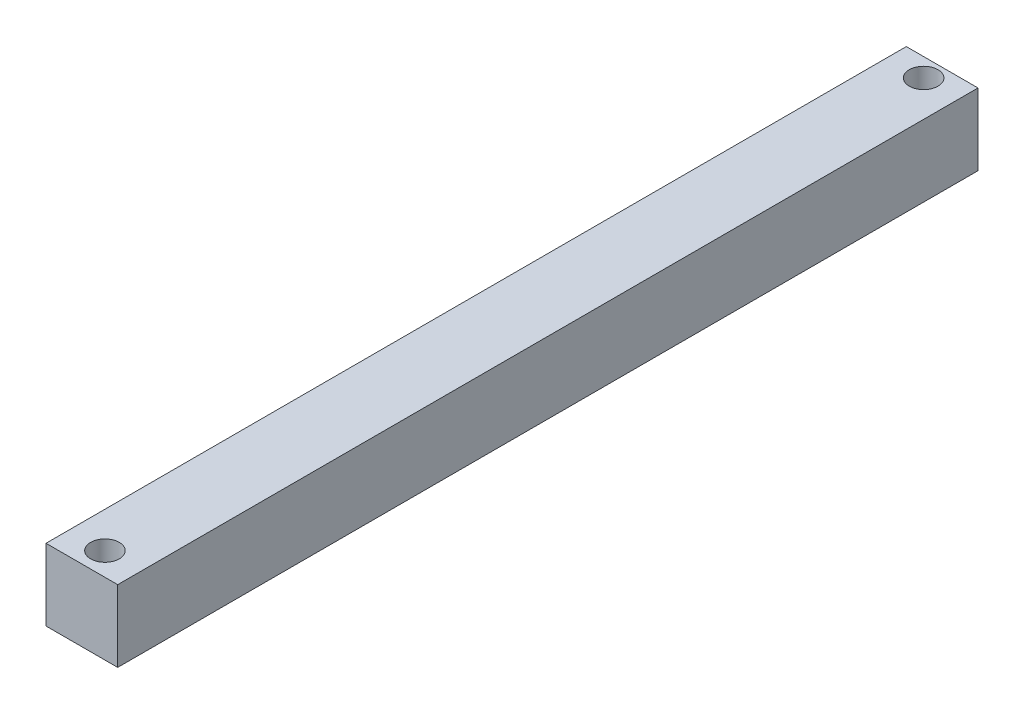
ISO-10303-21;
HEADER;
FILE_DESCRIPTION(('STEP AP214'),'2;1');
FILE_NAME('part.step','',(''),(''),'','','');
FILE_SCHEMA(('AUTOMOTIVE_DESIGN { 1 0 10303 214 1 1 1 1 }'));
ENDSEC;
DATA;
#1=APPLICATION_CONTEXT('core data for automotive mechanical design processes');
#2=APPLICATION_PROTOCOL_DEFINITION('international standard','automotive_design',2000,#1);
#3=PRODUCT_CONTEXT('',#1,'mechanical');
#4=PRODUCT('Part','Part','',(#3));
#5=PRODUCT_RELATED_PRODUCT_CATEGORY('part','',(#4));
#6=PRODUCT_DEFINITION_FORMATION('','',#4);
#7=PRODUCT_DEFINITION_CONTEXT('part definition',#1,'design');
#8=PRODUCT_DEFINITION('design','',#6,#7);
#9=PRODUCT_DEFINITION_SHAPE('','',#8);
#10=(LENGTH_UNIT() NAMED_UNIT(*) SI_UNIT(.MILLI.,.METRE.));
#11=(NAMED_UNIT(*) PLANE_ANGLE_UNIT() SI_UNIT($,.RADIAN.));
#12=(NAMED_UNIT(*) SI_UNIT($,.STERADIAN.) SOLID_ANGLE_UNIT());
#13=UNCERTAINTY_MEASURE_WITH_UNIT(LENGTH_MEASURE(1.E-05),#10,'distance_accuracy_value','');
#14=(GEOMETRIC_REPRESENTATION_CONTEXT(3) GLOBAL_UNCERTAINTY_ASSIGNED_CONTEXT((#13)) GLOBAL_UNIT_ASSIGNED_CONTEXT((#10,
#11,#12)) REPRESENTATION_CONTEXT('',''));
#15=CARTESIAN_POINT('',(0.,0.,0.));
#16=DIRECTION('',(0.,0.,1.));
#17=DIRECTION('',(1.,0.,0.));
#18=AXIS2_PLACEMENT_3D('',#15,#16,#17);
#19=CARTESIAN_POINT('',(-14.1298875809077,10.6681034482759,360.));
#20=DIRECTION('',(1.,0.,0.));
#21=DIRECTION('',(0.,1.,0.));
#22=AXIS2_PLACEMENT_3D('',#19,#20,#21);
#23=PLANE('',#22);
#24=DIRECTION('',(0.,-1.,0.));
#25=VECTOR('',#24,1.);
#26=CARTESIAN_POINT('',(-14.1298875809077,10.6681034482759,0.));
#27=LINE('',#26,#25);
#28=CARTESIAN_POINT('',(-14.1298875809077,10.6681034482759,0.));
#29=VERTEX_POINT('',#28);
#30=CARTESIAN_POINT('',(-14.1298875809077,-19.3318965517241,0.));
#31=VERTEX_POINT('',#30);
#32=EDGE_CURVE('E96',#29,#31,#27,.T.);
#33=ORIENTED_EDGE('',*,*,#32,.T.);
#34=DIRECTION('',(0.,0.,-1.));
#35=VECTOR('',#34,1.);
#36=CARTESIAN_POINT('',(-14.1298875809077,-19.3318965517241,360.));
#37=LINE('',#36,#35);
#38=CARTESIAN_POINT('',(-14.1298875809077,-19.3318965517241,360.));
#39=VERTEX_POINT('',#38);
#40=EDGE_CURVE('E11',#39,#31,#37,.T.);
#41=ORIENTED_EDGE('',*,*,#40,.F.);
#42=DIRECTION('',(0.,-1.,0.));
#43=VECTOR('',#42,1.);
#44=CARTESIAN_POINT('',(-14.1298875809077,10.6681034482759,360.));
#45=LINE('',#44,#43);
#46=CARTESIAN_POINT('',(-14.1298875809077,10.6681034482759,360.));
#47=VERTEX_POINT('',#46);
#48=EDGE_CURVE('E84',#47,#39,#45,.T.);
#49=ORIENTED_EDGE('',*,*,#48,.F.);
#50=DIRECTION('',(0.,0.,-1.));
#51=VECTOR('',#50,1.);
#52=CARTESIAN_POINT('',(-14.1298875809077,10.6681034482759,360.));
#53=LINE('',#52,#51);
#54=EDGE_CURVE('E92',#47,#29,#53,.T.);
#55=ORIENTED_EDGE('',*,*,#54,.T.);
#56=EDGE_LOOP('',(#33,#41,#49,#55));
#57=FACE_BOUND('',#56,.T.);
#58=ADVANCED_FACE('F33',(#57),#23,.F.);
#59=CARTESIAN_POINT('',(-14.1298875809077,-19.3318965517241,360.));
#60=DIRECTION('',(0.,1.,0.));
#61=DIRECTION('',(0.,0.,1.));
#62=AXIS2_PLACEMENT_3D('',#59,#60,#61);
#63=PLANE('',#62);
#64=CARTESIAN_POINT('',(0.870112419092328,-19.3318965517242,7.74865288261584));
#65=DIRECTION('',(0.,1.,0.));
#66=DIRECTION('',(0.,0.,1.));
#67=AXIS2_PLACEMENT_3D('',#64,#65,#66);
#68=CIRCLE('',#67,6.);
#69=CARTESIAN_POINT('',(0.870112419092328,-19.3318965517242,13.7486528826158));
#70=VERTEX_POINT('',#69);
#71=EDGE_CURVE('E99',#70,#70,#68,.T.);
#72=ORIENTED_EDGE('',*,*,#71,.T.);
#73=EDGE_LOOP('',(#72));
#74=FACE_BOUND('',#73,.T.);
#75=CARTESIAN_POINT('',(0.870112419092328,-19.3318965517242,350.334781363644));
#76=DIRECTION('',(0.,1.,0.));
#77=DIRECTION('',(0.,0.,1.));
#78=AXIS2_PLACEMENT_3D('',#75,#76,#77);
#79=CIRCLE('',#78,6.);
#80=CARTESIAN_POINT('',(0.870112419092328,-19.3318965517242,356.334781363644));
#81=VERTEX_POINT('',#80);
#82=EDGE_CURVE('E112',#81,#81,#79,.T.);
#83=ORIENTED_EDGE('',*,*,#82,.T.);
#84=EDGE_LOOP('',(#83));
#85=FACE_BOUND('',#84,.T.);
#86=DIRECTION('',(1.,0.,0.));
#87=VECTOR('',#86,1.);
#88=CARTESIAN_POINT('',(-14.1298875809077,-19.3318965517241,0.));
#89=LINE('',#88,#87);
#90=CARTESIAN_POINT('',(15.8701124190923,-19.3318965517241,0.));
#91=VERTEX_POINT('',#90);
#92=EDGE_CURVE('E88',#31,#91,#89,.T.);
#93=ORIENTED_EDGE('',*,*,#92,.T.);
#94=DIRECTION('',(0.,0.,-1.));
#95=VECTOR('',#94,1.);
#96=CARTESIAN_POINT('',(15.8701124190923,-19.3318965517241,360.));
#97=LINE('',#96,#95);
#98=CARTESIAN_POINT('',(15.8701124190923,-19.3318965517241,360.));
#99=VERTEX_POINT('',#98);
#100=EDGE_CURVE('E41',#99,#91,#97,.T.);
#101=ORIENTED_EDGE('',*,*,#100,.F.);
#102=DIRECTION('',(1.,0.,0.));
#103=VECTOR('',#102,1.);
#104=CARTESIAN_POINT('',(-14.1298875809077,-19.3318965517241,360.));
#105=LINE('',#104,#103);
#106=EDGE_CURVE('E79',#39,#99,#105,.T.);
#107=ORIENTED_EDGE('',*,*,#106,.F.);
#108=ORIENTED_EDGE('',*,*,#40,.T.);
#109=EDGE_LOOP('',(#93,#101,#107,#108));
#110=FACE_BOUND('',#109,.T.);
#111=ADVANCED_FACE('F87',(#74,#85,#110),#63,.F.);
#112=CARTESIAN_POINT('',(15.8701124190923,10.6681034482759,360.));
#113=DIRECTION('',(-1.,0.,0.));
#114=DIRECTION('',(0.,-1.,0.));
#115=AXIS2_PLACEMENT_3D('',#112,#113,#114);
#116=PLANE('',#115);
#117=DIRECTION('',(0.,1.,0.));
#118=VECTOR('',#117,1.);
#119=CARTESIAN_POINT('',(15.8701124190923,10.6681034482759,0.));
#120=LINE('',#119,#118);
#121=CARTESIAN_POINT('',(15.8701124190923,10.6681034482759,0.));
#122=VERTEX_POINT('',#121);
#123=EDGE_CURVE('E66',#91,#122,#120,.T.);
#124=ORIENTED_EDGE('',*,*,#123,.T.);
#125=DIRECTION('',(0.,0.,-1.));
#126=VECTOR('',#125,1.);
#127=CARTESIAN_POINT('',(15.8701124190923,10.6681034482759,360.));
#128=LINE('',#127,#126);
#129=CARTESIAN_POINT('',(15.8701124190923,10.6681034482759,360.));
#130=VERTEX_POINT('',#129);
#131=EDGE_CURVE('E89',#130,#122,#128,.T.);
#132=ORIENTED_EDGE('',*,*,#131,.F.);
#133=DIRECTION('',(0.,1.,0.));
#134=VECTOR('',#133,1.);
#135=CARTESIAN_POINT('',(15.8701124190923,10.6681034482759,360.));
#136=LINE('',#135,#134);
#137=EDGE_CURVE('E82',#99,#130,#136,.T.);
#138=ORIENTED_EDGE('',*,*,#137,.F.);
#139=ORIENTED_EDGE('',*,*,#100,.T.);
#140=EDGE_LOOP('',(#124,#132,#138,#139));
#141=FACE_BOUND('',#140,.T.);
#142=ADVANCED_FACE('F90',(#141),#116,.F.);
#143=CARTESIAN_POINT('',(-14.1298875809077,10.6681034482759,360.));
#144=DIRECTION('',(0.,-1.,0.));
#145=DIRECTION('',(0.,0.,-1.));
#146=AXIS2_PLACEMENT_3D('',#143,#144,#145);
#147=PLANE('',#146);
#148=CARTESIAN_POINT('',(0.870112419092328,10.6681034482759,7.74865288261584));
#149=DIRECTION('',(0.,1.,0.));
#150=DIRECTION('',(0.,0.,1.));
#151=AXIS2_PLACEMENT_3D('',#148,#149,#150);
#152=CIRCLE('',#151,6.);
#153=CARTESIAN_POINT('',(0.870112419092328,10.6681034482759,13.7486528826158));
#154=VERTEX_POINT('',#153);
#155=EDGE_CURVE('E115',#154,#154,#152,.T.);
#156=ORIENTED_EDGE('',*,*,#155,.F.);
#157=EDGE_LOOP('',(#156));
#158=FACE_BOUND('',#157,.T.);
#159=CARTESIAN_POINT('',(0.870112419092328,10.6681034482759,350.334781363644));
#160=DIRECTION('',(0.,1.,0.));
#161=DIRECTION('',(0.,0.,1.));
#162=AXIS2_PLACEMENT_3D('',#159,#160,#161);
#163=CIRCLE('',#162,6.);
#164=CARTESIAN_POINT('',(0.870112419092328,10.6681034482759,356.334781363644));
#165=VERTEX_POINT('',#164);
#166=EDGE_CURVE('E116',#165,#165,#163,.T.);
#167=ORIENTED_EDGE('',*,*,#166,.F.);
#168=EDGE_LOOP('',(#167));
#169=FACE_BOUND('',#168,.T.);
#170=DIRECTION('',(-1.,0.,0.));
#171=VECTOR('',#170,1.);
#172=CARTESIAN_POINT('',(-14.1298875809077,10.6681034482759,0.));
#173=LINE('',#172,#171);
#174=EDGE_CURVE('E72',#122,#29,#173,.T.);
#175=ORIENTED_EDGE('',*,*,#174,.T.);
#176=ORIENTED_EDGE('',*,*,#54,.F.);
#177=DIRECTION('',(-1.,0.,0.));
#178=VECTOR('',#177,1.);
#179=CARTESIAN_POINT('',(-14.1298875809077,10.6681034482759,360.));
#180=LINE('',#179,#178);
#181=EDGE_CURVE('E49',#130,#47,#180,.T.);
#182=ORIENTED_EDGE('',*,*,#181,.F.);
#183=ORIENTED_EDGE('',*,*,#131,.T.);
#184=EDGE_LOOP('',(#175,#176,#182,#183));
#185=FACE_BOUND('',#184,.T.);
#186=ADVANCED_FACE('F104',(#158,#169,#185),#147,.F.);
#187=CARTESIAN_POINT('',(0.,0.,360.));
#188=DIRECTION('',(0.,0.,1.));
#189=DIRECTION('',(1.,0.,0.));
#190=AXIS2_PLACEMENT_3D('',#187,#188,#189);
#191=PLANE('',#190);
#192=ORIENTED_EDGE('',*,*,#48,.T.);
#193=ORIENTED_EDGE('',*,*,#106,.T.);
#194=ORIENTED_EDGE('',*,*,#137,.T.);
#195=ORIENTED_EDGE('',*,*,#181,.T.);
#196=EDGE_LOOP('',(#192,#193,#194,#195));
#197=FACE_BOUND('',#196,.T.);
#198=ADVANCED_FACE('F80',(#197),#191,.T.);
#199=CARTESIAN_POINT('',(0.,0.,0.));
#200=DIRECTION('',(0.,0.,1.));
#201=DIRECTION('',(1.,0.,0.));
#202=AXIS2_PLACEMENT_3D('',#199,#200,#201);
#203=PLANE('',#202);
#204=ORIENTED_EDGE('',*,*,#32,.F.);
#205=ORIENTED_EDGE('',*,*,#174,.F.);
#206=ORIENTED_EDGE('',*,*,#123,.F.);
#207=ORIENTED_EDGE('',*,*,#92,.F.);
#208=EDGE_LOOP('',(#204,#205,#206,#207));
#209=FACE_BOUND('',#208,.T.);
#210=ADVANCED_FACE('F107',(#209),#203,.F.);
#211=CARTESIAN_POINT('',(0.870112419092328,-349.331896551724,350.334781363644));
#212=DIRECTION('',(0.,1.,0.));
#213=DIRECTION('',(0.,0.,1.));
#214=AXIS2_PLACEMENT_3D('',#211,#212,#213);
#215=CYLINDRICAL_SURFACE('',#214,6.);
#216=CARTESIAN_POINT('',(0.870112419092328,10.6681034482759,356.334781363644));
#217=CARTESIAN_POINT('',(0.870112419092328,10.3556034482759,356.334781363644));
#218=CARTESIAN_POINT('',(0.870112419092328,10.0431034482759,356.334781363644));
#219=CARTESIAN_POINT('',(0.870112419092328,9.41810344827591,356.334781363644));
#220=CARTESIAN_POINT('',(0.870112419092328,9.1056034482759,356.334781363644));
#221=CARTESIAN_POINT('',(0.870112419092328,8.48060344827589,356.334781363644));
#222=CARTESIAN_POINT('',(0.870112419092328,8.1681034482759,356.334781363644));
#223=CARTESIAN_POINT('',(0.870112419092328,7.54310344827589,356.334781363644));
#224=CARTESIAN_POINT('',(0.870112419092328,7.23060344827588,356.334781363644));
#225=CARTESIAN_POINT('',(0.870112419092328,6.60560344827588,356.334781363644));
#226=CARTESIAN_POINT('',(0.870112419092328,6.29310344827588,356.334781363644));
#227=CARTESIAN_POINT('',(0.870112419092328,5.66810344827588,356.334781363644));
#228=CARTESIAN_POINT('',(0.870112419092328,5.35560344827587,356.334781363644));
#229=CARTESIAN_POINT('',(0.870112419092328,4.73060344827586,356.334781363644));
#230=CARTESIAN_POINT('',(0.870112419092328,4.41810344827587,356.334781363644));
#231=CARTESIAN_POINT('',(0.870112419092328,3.79310344827586,356.334781363644));
#232=CARTESIAN_POINT('',(0.870112419092328,3.48060344827585,356.334781363644));
#233=CARTESIAN_POINT('',(0.870112419092328,2.85560344827585,356.334781363644));
#234=CARTESIAN_POINT('',(0.870112419092328,2.54310344827585,356.334781363644));
#235=CARTESIAN_POINT('',(0.870112419092328,1.91810344827587,356.334781363644));
#236=CARTESIAN_POINT('',(0.870112419092328,1.60560344827587,356.334781363644));
#237=CARTESIAN_POINT('',(0.870112419092328,0.980603448275867,356.334781363644));
#238=CARTESIAN_POINT('',(0.870112419092328,0.668103448275855,356.334781363644));
#239=CARTESIAN_POINT('',(0.870112419092328,0.0431034482758496,356.334781363644));
#240=CARTESIAN_POINT('',(0.870112419092328,-0.269396551724144,356.334781363644));
#241=CARTESIAN_POINT('',(0.870112419092328,-0.894396551724149,356.334781363644));
#242=CARTESIAN_POINT('',(0.870112419092328,-1.20689655172416,356.334781363644));
#243=CARTESIAN_POINT('',(0.870112419092328,-1.83189655172417,356.334781363644));
#244=CARTESIAN_POINT('',(0.870112419092328,-2.14439655172416,356.334781363644));
#245=CARTESIAN_POINT('',(0.870112419092328,-2.76939655172416,356.334781363644));
#246=CARTESIAN_POINT('',(0.870112419092328,-3.08189655172418,356.334781363644));
#247=CARTESIAN_POINT('',(0.870112419092328,-3.70689655172418,356.334781363644));
#248=CARTESIAN_POINT('',(0.870112419092328,-4.01939655172417,356.334781363644));
#249=CARTESIAN_POINT('',(0.870112419092328,-4.64439655172416,356.334781363644));
#250=CARTESIAN_POINT('',(0.870112419092328,-4.95689655172415,356.334781363644));
#251=CARTESIAN_POINT('',(0.870112419092328,-5.58189655172416,356.334781363644));
#252=CARTESIAN_POINT('',(0.870112419092328,-5.89439655172417,356.334781363644));
#253=CARTESIAN_POINT('',(0.870112419092328,-6.51939655172418,356.334781363644));
#254=CARTESIAN_POINT('',(0.870112419092328,-6.83189655172417,356.334781363644));
#255=CARTESIAN_POINT('',(0.870112419092328,-7.45689655172418,356.334781363644));
#256=CARTESIAN_POINT('',(0.870112419092328,-7.76939655172419,356.334781363644));
#257=CARTESIAN_POINT('',(0.870112419092328,-8.39439655172419,356.334781363644));
#258=CARTESIAN_POINT('',(0.870112419092328,-8.70689655172418,356.334781363644));
#259=CARTESIAN_POINT('',(0.870112419092328,-9.33189655172419,356.334781363644));
#260=CARTESIAN_POINT('',(0.870112419092328,-9.6443965517242,356.334781363644));
#261=CARTESIAN_POINT('',(0.870112419092328,-10.2693965517242,356.334781363644));
#262=CARTESIAN_POINT('',(0.870112419092328,-10.5818965517242,356.334781363644));
#263=CARTESIAN_POINT('',(0.870112419092328,-11.2068965517242,356.334781363644));
#264=CARTESIAN_POINT('',(0.870112419092328,-11.5193965517242,356.334781363644));
#265=CARTESIAN_POINT('',(0.870112419092328,-12.1443965517242,356.334781363644));
#266=CARTESIAN_POINT('',(0.870112419092328,-12.4568965517242,356.334781363644));
#267=CARTESIAN_POINT('',(0.870112419092328,-13.0818965517242,356.334781363644));
#268=CARTESIAN_POINT('',(0.870112419092328,-13.3943965517242,356.334781363644));
#269=CARTESIAN_POINT('',(0.870112419092328,-14.0193965517242,356.334781363644));
#270=CARTESIAN_POINT('',(0.870112419092328,-14.3318965517242,356.334781363644));
#271=CARTESIAN_POINT('',(0.870112419092328,-14.9568965517242,356.334781363644));
#272=CARTESIAN_POINT('',(0.870112419092328,-15.2693965517242,356.334781363644));
#273=CARTESIAN_POINT('',(0.870112419092328,-15.8943965517242,356.334781363644));
#274=CARTESIAN_POINT('',(0.870112419092328,-16.2068965517242,356.334781363644));
#275=CARTESIAN_POINT('',(0.870112419092328,-16.8318965517242,356.334781363644));
#276=CARTESIAN_POINT('',(0.870112419092328,-17.1443965517242,356.334781363644));
#277=CARTESIAN_POINT('',(0.870112419092328,-17.7693965517242,356.334781363644));
#278=CARTESIAN_POINT('',(0.870112419092328,-18.0818965517242,356.334781363644));
#279=CARTESIAN_POINT('',(0.870112419092328,-18.7068965517242,356.334781363644));
#280=CARTESIAN_POINT('',(0.870112419092328,-19.0193965517242,356.334781363644));
#281=CARTESIAN_POINT('',(0.870112419092328,-19.3318965517242,356.334781363644));
#282=B_SPLINE_CURVE_WITH_KNOTS('',3,(#216,#217,#218,#219,#220,#221,#222,#223,#224,#225,#226,
#227,#228,#229,#230,#231,#232,#233,#234,#235,#236,#237,#238,#239,#240,#241,#242,#243,#244,#245,
#246,#247,#248,#249,#250,#251,#252,#253,#254,#255,#256,#257,#258,#259,#260,#261,#262,#263,#264,
#265,#266,#267,#268,#269,#270,#271,#272,#273,#274,#275,#276,#277,#278,#279,#280,#281),
.UNSPECIFIED.,.F.,.F.,(4,2,2,2,2,2,2,2,2,2,2,2,2,2,2,2,2,2,2,2,2,2,2,2,2,2,2,2,2,2,2,2,4),(0.,
0.93749999999998,1.87500000000002,2.8125,3.75000000000003,4.68750000000001,5.62500000000005,
6.56250000000003,7.50000000000006,8.43750000000004,9.37500000000002,10.3125000000001,11.25,
12.1875000000001,13.1250000000001,14.0625000000001,15.0000000000001,15.9375,16.8750000000001,
17.8125000000001,18.7500000000001,19.6875000000001,20.6250000000001,21.5625000000001,
22.5000000000001,23.4375000000001,24.3750000000001,25.3125000000001,26.2500000000001,
27.1875000000001,28.1250000000001,29.0625000000002,30.0000000000001),.UNSPECIFIED.);
#283=EDGE_CURVE('BSEAM130',#165,#81,#282,.T.);
#284=ORIENTED_EDGE('',*,*,#166,.T.);
#285=ORIENTED_EDGE('',*,*,#82,.F.);
#286=ORIENTED_EDGE('',*,*,#283,.T.);
#287=ORIENTED_EDGE('',*,*,#283,.F.);
#288=EDGE_LOOP('',(#284,#286,#285,#287));
#289=FACE_BOUND('',#288,.T.);
#290=ADVANCED_FACE('F130',(#289),#215,.F.);
#291=CARTESIAN_POINT('',(0.870112419092328,-349.331896551724,7.74865288261584));
#292=DIRECTION('',(0.,1.,0.));
#293=DIRECTION('',(0.,0.,1.));
#294=AXIS2_PLACEMENT_3D('',#291,#292,#293);
#295=CYLINDRICAL_SURFACE('',#294,6.);
#296=CARTESIAN_POINT('',(0.870112419092328,10.6681034482759,13.7486528826158));
#297=CARTESIAN_POINT('',(0.870112419092328,10.3556034482759,13.7486528826158));
#298=CARTESIAN_POINT('',(0.870112419092328,10.0431034482759,13.7486528826158));
#299=CARTESIAN_POINT('',(0.870112419092328,9.41810344827591,13.7486528826158));
#300=CARTESIAN_POINT('',(0.870112419092328,9.1056034482759,13.7486528826158));
#301=CARTESIAN_POINT('',(0.870112419092328,8.48060344827589,13.7486528826158));
#302=CARTESIAN_POINT('',(0.870112419092328,8.1681034482759,13.7486528826158));
#303=CARTESIAN_POINT('',(0.870112419092328,7.54310344827589,13.7486528826158));
#304=CARTESIAN_POINT('',(0.870112419092328,7.23060344827588,13.7486528826158));
#305=CARTESIAN_POINT('',(0.870112419092328,6.60560344827588,13.7486528826158));
#306=CARTESIAN_POINT('',(0.870112419092328,6.29310344827588,13.7486528826158));
#307=CARTESIAN_POINT('',(0.870112419092328,5.66810344827588,13.7486528826158));
#308=CARTESIAN_POINT('',(0.870112419092328,5.35560344827587,13.7486528826158));
#309=CARTESIAN_POINT('',(0.870112419092328,4.73060344827586,13.7486528826158));
#310=CARTESIAN_POINT('',(0.870112419092328,4.41810344827587,13.7486528826158));
#311=CARTESIAN_POINT('',(0.870112419092328,3.79310344827586,13.7486528826158));
#312=CARTESIAN_POINT('',(0.870112419092328,3.48060344827585,13.7486528826158));
#313=CARTESIAN_POINT('',(0.870112419092328,2.85560344827585,13.7486528826158));
#314=CARTESIAN_POINT('',(0.870112419092328,2.54310344827585,13.7486528826158));
#315=CARTESIAN_POINT('',(0.870112419092328,1.91810344827587,13.7486528826158));
#316=CARTESIAN_POINT('',(0.870112419092328,1.60560344827587,13.7486528826158));
#317=CARTESIAN_POINT('',(0.870112419092328,0.980603448275867,13.7486528826158));
#318=CARTESIAN_POINT('',(0.870112419092328,0.668103448275855,13.7486528826158));
#319=CARTESIAN_POINT('',(0.870112419092328,0.0431034482758496,13.7486528826158));
#320=CARTESIAN_POINT('',(0.870112419092328,-0.269396551724144,13.7486528826158));
#321=CARTESIAN_POINT('',(0.870112419092328,-0.894396551724149,13.7486528826158));
#322=CARTESIAN_POINT('',(0.870112419092328,-1.20689655172416,13.7486528826158));
#323=CARTESIAN_POINT('',(0.870112419092328,-1.83189655172417,13.7486528826158));
#324=CARTESIAN_POINT('',(0.870112419092328,-2.14439655172416,13.7486528826158));
#325=CARTESIAN_POINT('',(0.870112419092328,-2.76939655172416,13.7486528826158));
#326=CARTESIAN_POINT('',(0.870112419092328,-3.08189655172418,13.7486528826158));
#327=CARTESIAN_POINT('',(0.870112419092328,-3.70689655172418,13.7486528826158));
#328=CARTESIAN_POINT('',(0.870112419092328,-4.01939655172417,13.7486528826158));
#329=CARTESIAN_POINT('',(0.870112419092328,-4.64439655172416,13.7486528826158));
#330=CARTESIAN_POINT('',(0.870112419092328,-4.95689655172415,13.7486528826158));
#331=CARTESIAN_POINT('',(0.870112419092328,-5.58189655172416,13.7486528826158));
#332=CARTESIAN_POINT('',(0.870112419092328,-5.89439655172417,13.7486528826158));
#333=CARTESIAN_POINT('',(0.870112419092328,-6.51939655172418,13.7486528826158));
#334=CARTESIAN_POINT('',(0.870112419092328,-6.83189655172417,13.7486528826158));
#335=CARTESIAN_POINT('',(0.870112419092328,-7.45689655172418,13.7486528826158));
#336=CARTESIAN_POINT('',(0.870112419092328,-7.76939655172419,13.7486528826158));
#337=CARTESIAN_POINT('',(0.870112419092328,-8.39439655172419,13.7486528826158));
#338=CARTESIAN_POINT('',(0.870112419092328,-8.70689655172418,13.7486528826158));
#339=CARTESIAN_POINT('',(0.870112419092328,-9.33189655172419,13.7486528826158));
#340=CARTESIAN_POINT('',(0.870112419092328,-9.6443965517242,13.7486528826158));
#341=CARTESIAN_POINT('',(0.870112419092328,-10.2693965517242,13.7486528826158));
#342=CARTESIAN_POINT('',(0.870112419092328,-10.5818965517242,13.7486528826158));
#343=CARTESIAN_POINT('',(0.870112419092328,-11.2068965517242,13.7486528826158));
#344=CARTESIAN_POINT('',(0.870112419092328,-11.5193965517242,13.7486528826158));
#345=CARTESIAN_POINT('',(0.870112419092328,-12.1443965517242,13.7486528826158));
#346=CARTESIAN_POINT('',(0.870112419092328,-12.4568965517242,13.7486528826158));
#347=CARTESIAN_POINT('',(0.870112419092328,-13.0818965517242,13.7486528826158));
#348=CARTESIAN_POINT('',(0.870112419092328,-13.3943965517242,13.7486528826158));
#349=CARTESIAN_POINT('',(0.870112419092328,-14.0193965517242,13.7486528826158));
#350=CARTESIAN_POINT('',(0.870112419092328,-14.3318965517242,13.7486528826158));
#351=CARTESIAN_POINT('',(0.870112419092328,-14.9568965517242,13.7486528826158));
#352=CARTESIAN_POINT('',(0.870112419092328,-15.2693965517242,13.7486528826158));
#353=CARTESIAN_POINT('',(0.870112419092328,-15.8943965517242,13.7486528826158));
#354=CARTESIAN_POINT('',(0.870112419092328,-16.2068965517242,13.7486528826158));
#355=CARTESIAN_POINT('',(0.870112419092328,-16.8318965517242,13.7486528826158));
#356=CARTESIAN_POINT('',(0.870112419092328,-17.1443965517242,13.7486528826158));
#357=CARTESIAN_POINT('',(0.870112419092328,-17.7693965517242,13.7486528826158));
#358=CARTESIAN_POINT('',(0.870112419092328,-18.0818965517242,13.7486528826158));
#359=CARTESIAN_POINT('',(0.870112419092328,-18.7068965517242,13.7486528826158));
#360=CARTESIAN_POINT('',(0.870112419092328,-19.0193965517242,13.7486528826158));
#361=CARTESIAN_POINT('',(0.870112419092328,-19.3318965517242,13.7486528826158));
#362=B_SPLINE_CURVE_WITH_KNOTS('',3,(#296,#297,#298,#299,#300,#301,#302,#303,#304,#305,#306,
#307,#308,#309,#310,#311,#312,#313,#314,#315,#316,#317,#318,#319,#320,#321,#322,#323,#324,#325,
#326,#327,#328,#329,#330,#331,#332,#333,#334,#335,#336,#337,#338,#339,#340,#341,#342,#343,#344,
#345,#346,#347,#348,#349,#350,#351,#352,#353,#354,#355,#356,#357,#358,#359,#360,#361),
.UNSPECIFIED.,.F.,.F.,(4,2,2,2,2,2,2,2,2,2,2,2,2,2,2,2,2,2,2,2,2,2,2,2,2,2,2,2,2,2,2,2,4),(0.,
0.93749999999998,1.87500000000002,2.8125,3.75000000000003,4.68750000000001,5.62500000000005,
6.56250000000003,7.50000000000006,8.43750000000004,9.37500000000002,10.3125000000001,11.25,
12.1875000000001,13.1250000000001,14.0625000000001,15.0000000000001,15.9375,16.8750000000001,
17.8125000000001,18.7500000000001,19.6875000000001,20.6250000000001,21.5625000000001,
22.5000000000001,23.4375000000001,24.3750000000001,25.3125000000001,26.2500000000001,
27.1875000000001,28.1250000000001,29.0625000000002,30.0000000000001),.UNSPECIFIED.);
#363=EDGE_CURVE('BSEAM122',#154,#70,#362,.T.);
#364=ORIENTED_EDGE('',*,*,#155,.T.);
#365=ORIENTED_EDGE('',*,*,#71,.F.);
#366=ORIENTED_EDGE('',*,*,#363,.T.);
#367=ORIENTED_EDGE('',*,*,#363,.F.);
#368=EDGE_LOOP('',(#364,#366,#365,#367));
#369=FACE_BOUND('',#368,.T.);
#370=ADVANCED_FACE('F122',(#369),#295,.F.);
#371=CLOSED_SHELL('',(#58,#111,#142,#186,#198,#210,#290,#370));
#372=MANIFOLD_SOLID_BREP('B2',#371);
#373=ADVANCED_BREP_SHAPE_REPRESENTATION('',(#18,#372),#14);
#374=SHAPE_DEFINITION_REPRESENTATION(#9,#373);
ENDSEC;
END-ISO-10303-21;
